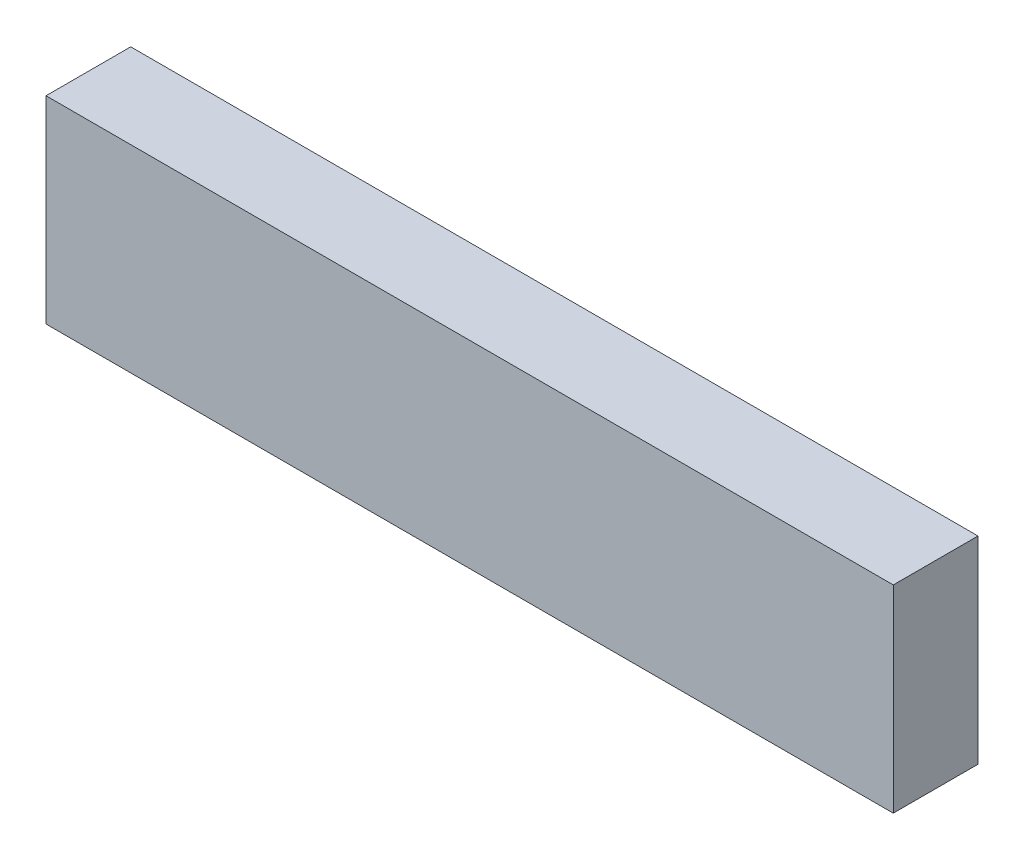
ISO-10303-21;
HEADER;
FILE_DESCRIPTION(('STEP AP214'),'2;1');
FILE_NAME('part.step','',(''),(''),'','','');
FILE_SCHEMA(('AUTOMOTIVE_DESIGN { 1 0 10303 214 1 1 1 1 }'));
ENDSEC;
DATA;
#1=APPLICATION_CONTEXT('core data for automotive mechanical design processes');
#2=APPLICATION_PROTOCOL_DEFINITION('international standard','automotive_design',2000,#1);
#3=PRODUCT_CONTEXT('',#1,'mechanical');
#4=PRODUCT('Part','Part','',(#3));
#5=PRODUCT_RELATED_PRODUCT_CATEGORY('part','',(#4));
#6=PRODUCT_DEFINITION_FORMATION('','',#4);
#7=PRODUCT_DEFINITION_CONTEXT('part definition',#1,'design');
#8=PRODUCT_DEFINITION('design','',#6,#7);
#9=PRODUCT_DEFINITION_SHAPE('','',#8);
#10=(LENGTH_UNIT() NAMED_UNIT(*) SI_UNIT(.MILLI.,.METRE.));
#11=(NAMED_UNIT(*) PLANE_ANGLE_UNIT() SI_UNIT($,.RADIAN.));
#12=(NAMED_UNIT(*) SI_UNIT($,.STERADIAN.) SOLID_ANGLE_UNIT());
#13=UNCERTAINTY_MEASURE_WITH_UNIT(LENGTH_MEASURE(1.E-05),#10,'distance_accuracy_value','');
#14=(GEOMETRIC_REPRESENTATION_CONTEXT(3) GLOBAL_UNCERTAINTY_ASSIGNED_CONTEXT((#13)) GLOBAL_UNIT_ASSIGNED_CONTEXT((#10,
#11,#12)) REPRESENTATION_CONTEXT('',''));
#15=CARTESIAN_POINT('',(0.,0.,0.));
#16=DIRECTION('',(0.,0.,1.));
#17=DIRECTION('',(1.,0.,0.));
#18=AXIS2_PLACEMENT_3D('',#15,#16,#17);
#19=CARTESIAN_POINT('',(150.,-35.,30.));
#20=DIRECTION('',(-1.,0.,0.));
#21=DIRECTION('',(0.,0.,1.));
#22=AXIS2_PLACEMENT_3D('',#19,#20,#21);
#23=PLANE('',#22);
#24=DIRECTION('',(0.,1.,0.));
#25=VECTOR('',#24,1.);
#26=CARTESIAN_POINT('',(150.,-35.,0.));
#27=LINE('',#26,#25);
#28=CARTESIAN_POINT('',(150.,-35.,0.));
#29=VERTEX_POINT('',#28);
#30=CARTESIAN_POINT('',(150.,35.,0.));
#31=VERTEX_POINT('',#30);
#32=EDGE_CURVE('E113',#29,#31,#27,.T.);
#33=ORIENTED_EDGE('',*,*,#32,.T.);
#34=DIRECTION('',(0.,0.,-1.));
#35=VECTOR('',#34,1.);
#36=CARTESIAN_POINT('',(150.,35.,30.));
#37=LINE('',#36,#35);
#38=CARTESIAN_POINT('',(150.,35.,30.));
#39=VERTEX_POINT('',#38);
#40=EDGE_CURVE('E11',#39,#31,#37,.T.);
#41=ORIENTED_EDGE('',*,*,#40,.F.);
#42=DIRECTION('',(0.,1.,0.));
#43=VECTOR('',#42,1.);
#44=CARTESIAN_POINT('',(150.,-35.,30.));
#45=LINE('',#44,#43);
#46=CARTESIAN_POINT('',(150.,-35.,30.));
#47=VERTEX_POINT('',#46);
#48=EDGE_CURVE('E97',#47,#39,#45,.T.);
#49=ORIENTED_EDGE('',*,*,#48,.F.);
#50=DIRECTION('',(0.,0.,-1.));
#51=VECTOR('',#50,1.);
#52=CARTESIAN_POINT('',(150.,-35.,30.));
#53=LINE('',#52,#51);
#54=EDGE_CURVE('E109',#47,#29,#53,.T.);
#55=ORIENTED_EDGE('',*,*,#54,.T.);
#56=EDGE_LOOP('',(#33,#41,#49,#55));
#57=FACE_BOUND('',#56,.T.);
#58=ADVANCED_FACE('F45',(#57),#23,.F.);
#59=CARTESIAN_POINT('',(-150.,35.,30.));
#60=DIRECTION('',(0.,-1.,0.));
#61=DIRECTION('',(0.,0.,-1.));
#62=AXIS2_PLACEMENT_3D('',#59,#60,#61);
#63=PLANE('',#62);
#64=DIRECTION('',(-1.,0.,0.));
#65=VECTOR('',#64,1.);
#66=CARTESIAN_POINT('',(-150.,35.,0.));
#67=LINE('',#66,#65);
#68=CARTESIAN_POINT('',(-150.,35.,0.));
#69=VERTEX_POINT('',#68);
#70=EDGE_CURVE('E102',#31,#69,#67,.T.);
#71=ORIENTED_EDGE('',*,*,#70,.T.);
#72=DIRECTION('',(0.,0.,-1.));
#73=VECTOR('',#72,1.);
#74=CARTESIAN_POINT('',(-150.,35.,30.));
#75=LINE('',#74,#73);
#76=CARTESIAN_POINT('',(-150.,35.,30.));
#77=VERTEX_POINT('',#76);
#78=EDGE_CURVE('E54',#77,#69,#75,.T.);
#79=ORIENTED_EDGE('',*,*,#78,.F.);
#80=DIRECTION('',(-1.,0.,0.));
#81=VECTOR('',#80,1.);
#82=CARTESIAN_POINT('',(-150.,35.,30.));
#83=LINE('',#82,#81);
#84=EDGE_CURVE('E92',#39,#77,#83,.T.);
#85=ORIENTED_EDGE('',*,*,#84,.F.);
#86=ORIENTED_EDGE('',*,*,#40,.T.);
#87=EDGE_LOOP('',(#71,#79,#85,#86));
#88=FACE_BOUND('',#87,.T.);
#89=ADVANCED_FACE('F101',(#88),#63,.F.);
#90=CARTESIAN_POINT('',(-150.,-35.,30.));
#91=DIRECTION('',(1.,0.,0.));
#92=DIRECTION('',(0.,0.,-1.));
#93=AXIS2_PLACEMENT_3D('',#90,#91,#92);
#94=PLANE('',#93);
#95=DIRECTION('',(0.,-1.,0.));
#96=VECTOR('',#95,1.);
#97=CARTESIAN_POINT('',(-150.,-35.,0.));
#98=LINE('',#97,#96);
#99=CARTESIAN_POINT('',(-150.,-35.,0.));
#100=VERTEX_POINT('',#99);
#101=EDGE_CURVE('E79',#69,#100,#98,.T.);
#102=ORIENTED_EDGE('',*,*,#101,.T.);
#103=DIRECTION('',(0.,0.,-1.));
#104=VECTOR('',#103,1.);
#105=CARTESIAN_POINT('',(-150.,-35.,30.));
#106=LINE('',#105,#104);
#107=CARTESIAN_POINT('',(-150.,-35.,30.));
#108=VERTEX_POINT('',#107);
#109=EDGE_CURVE('E104',#108,#100,#106,.T.);
#110=ORIENTED_EDGE('',*,*,#109,.F.);
#111=DIRECTION('',(0.,-1.,0.));
#112=VECTOR('',#111,1.);
#113=CARTESIAN_POINT('',(-150.,-35.,30.));
#114=LINE('',#113,#112);
#115=EDGE_CURVE('E95',#77,#108,#114,.T.);
#116=ORIENTED_EDGE('',*,*,#115,.F.);
#117=ORIENTED_EDGE('',*,*,#78,.T.);
#118=EDGE_LOOP('',(#102,#110,#116,#117));
#119=FACE_BOUND('',#118,.T.);
#120=ADVANCED_FACE('F105',(#119),#94,.F.);
#121=CARTESIAN_POINT('',(-150.,-35.,30.));
#122=DIRECTION('',(0.,1.,0.));
#123=DIRECTION('',(0.,0.,1.));
#124=AXIS2_PLACEMENT_3D('',#121,#122,#123);
#125=PLANE('',#124);
#126=DIRECTION('',(1.,0.,0.));
#127=VECTOR('',#126,1.);
#128=CARTESIAN_POINT('',(-150.,-35.,0.));
#129=LINE('',#128,#127);
#130=EDGE_CURVE('E85',#100,#29,#129,.T.);
#131=ORIENTED_EDGE('',*,*,#130,.T.);
#132=ORIENTED_EDGE('',*,*,#54,.F.);
#133=DIRECTION('',(1.,0.,0.));
#134=VECTOR('',#133,1.);
#135=CARTESIAN_POINT('',(-150.,-35.,30.));
#136=LINE('',#135,#134);
#137=EDGE_CURVE('E62',#108,#47,#136,.T.);
#138=ORIENTED_EDGE('',*,*,#137,.F.);
#139=ORIENTED_EDGE('',*,*,#109,.T.);
#140=EDGE_LOOP('',(#131,#132,#138,#139));
#141=FACE_BOUND('',#140,.T.);
#142=ADVANCED_FACE('F126',(#141),#125,.F.);
#143=CARTESIAN_POINT('',(0.,0.,30.));
#144=DIRECTION('',(0.,0.,-1.));
#145=DIRECTION('',(-1.,0.,0.));
#146=AXIS2_PLACEMENT_3D('',#143,#144,#145);
#147=PLANE('',#146);
#148=ORIENTED_EDGE('',*,*,#48,.T.);
#149=ORIENTED_EDGE('',*,*,#84,.T.);
#150=ORIENTED_EDGE('',*,*,#115,.T.);
#151=ORIENTED_EDGE('',*,*,#137,.T.);
#152=EDGE_LOOP('',(#148,#149,#150,#151));
#153=FACE_BOUND('',#152,.T.);
#154=ADVANCED_FACE('F93',(#153),#147,.F.);
#155=CARTESIAN_POINT('',(0.,0.,0.));
#156=DIRECTION('',(0.,0.,-1.));
#157=DIRECTION('',(-1.,0.,0.));
#158=AXIS2_PLACEMENT_3D('',#155,#156,#157);
#159=PLANE('',#158);
#160=ORIENTED_EDGE('',*,*,#32,.F.);
#161=ORIENTED_EDGE('',*,*,#130,.F.);
#162=ORIENTED_EDGE('',*,*,#101,.F.);
#163=ORIENTED_EDGE('',*,*,#70,.F.);
#164=EDGE_LOOP('',(#160,#161,#162,#163));
#165=FACE_BOUND('',#164,.T.);
#166=ADVANCED_FACE('F129',(#165),#159,.T.);
#167=CLOSED_SHELL('',(#58,#89,#120,#142,#154,#166));
#168=MANIFOLD_SOLID_BREP('B2',#167);
#169=ADVANCED_BREP_SHAPE_REPRESENTATION('',(#18,#168),#14);
#170=SHAPE_DEFINITION_REPRESENTATION(#9,#169);
ENDSEC;
END-ISO-10303-21;
